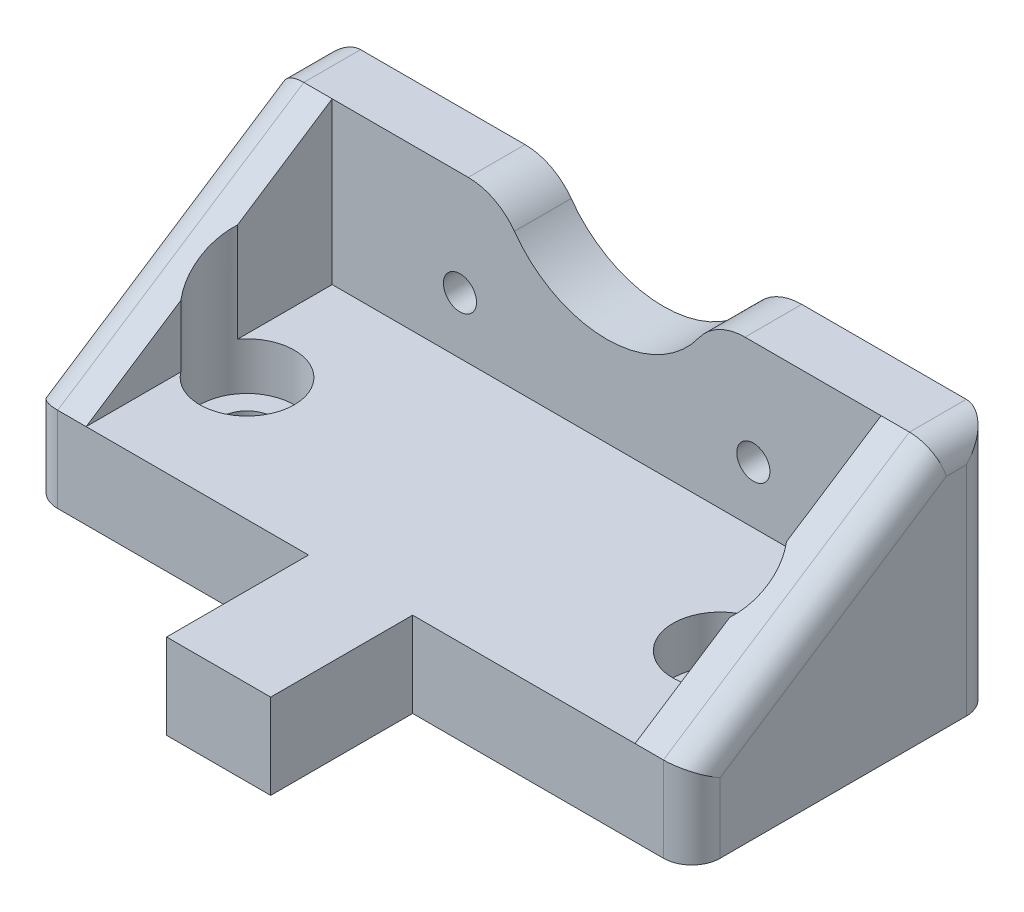
ISO-10303-21;
HEADER;
FILE_DESCRIPTION(('STEP AP214'),'2;1');
FILE_NAME('part.step','',(''),(''),'','','');
FILE_SCHEMA(('AUTOMOTIVE_DESIGN { 1 0 10303 214 1 1 1 1 }'));
ENDSEC;
DATA;
#1=APPLICATION_CONTEXT('core data for automotive mechanical design processes');
#2=APPLICATION_PROTOCOL_DEFINITION('international standard','automotive_design',2000,#1);
#3=PRODUCT_CONTEXT('',#1,'mechanical');
#4=PRODUCT('Part','Part','',(#3));
#5=PRODUCT_RELATED_PRODUCT_CATEGORY('part','',(#4));
#6=PRODUCT_DEFINITION_FORMATION('','',#4);
#7=PRODUCT_DEFINITION_CONTEXT('part definition',#1,'design');
#8=PRODUCT_DEFINITION('design','',#6,#7);
#9=PRODUCT_DEFINITION_SHAPE('','',#8);
#10=(LENGTH_UNIT() NAMED_UNIT(*) SI_UNIT(.MILLI.,.METRE.));
#11=(NAMED_UNIT(*) PLANE_ANGLE_UNIT() SI_UNIT($,.RADIAN.));
#12=(NAMED_UNIT(*) SI_UNIT($,.STERADIAN.) SOLID_ANGLE_UNIT());
#13=UNCERTAINTY_MEASURE_WITH_UNIT(LENGTH_MEASURE(1.E-05),#10,'distance_accuracy_value','');
#14=(GEOMETRIC_REPRESENTATION_CONTEXT(3) GLOBAL_UNCERTAINTY_ASSIGNED_CONTEXT((#13)) GLOBAL_UNIT_ASSIGNED_CONTEXT((#10,
#11,#12)) REPRESENTATION_CONTEXT('',''));
#15=CARTESIAN_POINT('',(0.,0.,0.));
#16=DIRECTION('',(0.,0.,1.));
#17=DIRECTION('',(1.,0.,0.));
#18=AXIS2_PLACEMENT_3D('',#15,#16,#17);
#19=CARTESIAN_POINT('',(14.6201915172135,20.,-10.));
#20=DIRECTION('',(0.,0.,1.));
#21=DIRECTION('',(1.,0.,0.));
#22=AXIS2_PLACEMENT_3D('',#19,#20,#21);
#23=PLANE('',#22);
#24=DIRECTION('',(1.,0.,0.));
#25=VECTOR('',#24,1.);
#26=CARTESIAN_POINT('',(-14.6201915172135,26.,-10.));
#27=LINE('',#26,#25);
#28=CARTESIAN_POINT('',(-29.,26.,-10.));
#29=VERTEX_POINT('',#28);
#30=CARTESIAN_POINT('',(-14.6201915172135,26.,-10.));
#31=VERTEX_POINT('',#30);
#32=EDGE_CURVE('E281',#29,#31,#27,.T.);
#33=ORIENTED_EDGE('',*,*,#32,.F.);
#34=DIRECTION('',(0.,1.,0.));
#35=VECTOR('',#34,1.);
#36=CARTESIAN_POINT('',(-29.,26.,-10.));
#37=LINE('',#36,#35);
#38=CARTESIAN_POINT('',(-29.,9.,-10.));
#39=VERTEX_POINT('',#38);
#40=EDGE_CURVE('E233',#39,#29,#37,.T.);
#41=ORIENTED_EDGE('',*,*,#40,.F.);
#42=DIRECTION('',(-1.,0.,0.));
#43=VECTOR('',#42,1.);
#44=CARTESIAN_POINT('',(35.,9.,-10.));
#45=LINE('',#44,#43);
#46=CARTESIAN_POINT('',(29.,9.,-10.));
#47=VERTEX_POINT('',#46);
#48=EDGE_CURVE('E278',#47,#39,#45,.T.);
#49=ORIENTED_EDGE('',*,*,#48,.F.);
#50=DIRECTION('',(0.,1.,0.));
#51=VECTOR('',#50,1.);
#52=CARTESIAN_POINT('',(29.,26.,-10.));
#53=LINE('',#52,#51);
#54=CARTESIAN_POINT('',(29.,26.,-10.));
#55=VERTEX_POINT('',#54);
#56=EDGE_CURVE('E259',#47,#55,#53,.T.);
#57=ORIENTED_EDGE('',*,*,#56,.T.);
#58=DIRECTION('',(1.,0.,0.));
#59=VECTOR('',#58,1.);
#60=CARTESIAN_POINT('',(35.,26.,-10.));
#61=LINE('',#60,#59);
#62=CARTESIAN_POINT('',(14.6201915172135,26.,-10.));
#63=VERTEX_POINT('',#62);
#64=EDGE_CURVE('E442',#63,#55,#61,.T.);
#65=ORIENTED_EDGE('',*,*,#64,.F.);
#66=CARTESIAN_POINT('',(14.6201915172135,20.,-10.));
#67=DIRECTION('',(0.,0.,-1.));
#68=DIRECTION('',(1.,0.,0.));
#69=AXIS2_PLACEMENT_3D('',#66,#67,#68);
#70=CIRCLE('',#69,6.);
#71=CARTESIAN_POINT('',(9.74679434480897,23.5,-10.));
#72=VERTEX_POINT('',#71);
#73=EDGE_CURVE('E555',#72,#63,#70,.T.);
#74=ORIENTED_EDGE('',*,*,#73,.F.);
#75=CARTESIAN_POINT('',(0.,30.5,-10.));
#76=DIRECTION('',(0.,0.,1.));
#77=DIRECTION('',(-1.,0.,0.));
#78=AXIS2_PLACEMENT_3D('',#75,#76,#77);
#79=CIRCLE('',#78,12.);
#80=CARTESIAN_POINT('',(-9.74679434480895,23.5,-10.));
#81=VERTEX_POINT('',#80);
#82=EDGE_CURVE('E557',#81,#72,#79,.T.);
#83=ORIENTED_EDGE('',*,*,#82,.F.);
#84=CARTESIAN_POINT('',(-14.6201915172135,19.9999999999999,-10.));
#85=DIRECTION('',(0.,0.,-1.));
#86=DIRECTION('',(-1.,0.,0.));
#87=AXIS2_PLACEMENT_3D('',#84,#85,#86);
#88=CIRCLE('',#87,6.00000000000011);
#89=EDGE_CURVE('E559',#31,#81,#88,.T.);
#90=ORIENTED_EDGE('',*,*,#89,.F.);
#91=EDGE_LOOP('',(#33,#41,#49,#57,#65,#74,#83,#90));
#92=FACE_BOUND('',#91,.T.);
#93=CARTESIAN_POINT('',(15.5,15.,-10.));
#94=DIRECTION('',(0.,0.,1.));
#95=DIRECTION('',(1.,0.,0.));
#96=AXIS2_PLACEMENT_3D('',#93,#94,#95);
#97=CIRCLE('',#96,1.75);
#98=CARTESIAN_POINT('',(17.25,15.,-10.));
#99=VERTEX_POINT('',#98);
#100=EDGE_CURVE('E236',#99,#99,#97,.T.);
#101=ORIENTED_EDGE('',*,*,#100,.F.);
#102=EDGE_LOOP('',(#101));
#103=FACE_BOUND('',#102,.T.);
#104=CARTESIAN_POINT('',(-15.5,15.,-10.));
#105=DIRECTION('',(0.,0.,-1.));
#106=DIRECTION('',(-1.,0.,0.));
#107=AXIS2_PLACEMENT_3D('',#104,#105,#106);
#108=CIRCLE('',#107,1.75);
#109=CARTESIAN_POINT('',(-17.25,15.,-10.));
#110=VERTEX_POINT('',#109);
#111=EDGE_CURVE('E342',#110,#110,#108,.T.);
#112=ORIENTED_EDGE('',*,*,#111,.T.);
#113=EDGE_LOOP('',(#112));
#114=FACE_BOUND('',#113,.T.);
#115=ADVANCED_FACE('F33',(#92,#103,#114),#23,.T.);
#116=CARTESIAN_POINT('',(-35.,9.,-16.));
#117=DIRECTION('',(0.,0.,1.));
#118=DIRECTION('',(1.,0.,0.));
#119=AXIS2_PLACEMENT_3D('',#116,#117,#118);
#120=PLANE('',#119);
#121=DIRECTION('',(1.,0.,0.));
#122=VECTOR('',#121,1.);
#123=CARTESIAN_POINT('',(35.,26.,-16.));
#124=LINE('',#123,#122);
#125=CARTESIAN_POINT('',(14.6201915172135,26.,-16.));
#126=VERTEX_POINT('',#125);
#127=CARTESIAN_POINT('',(32.,26.,-16.));
#128=VERTEX_POINT('',#127);
#129=EDGE_CURVE('E282',#126,#128,#124,.T.);
#130=ORIENTED_EDGE('',*,*,#129,.T.);
#131=DIRECTION('',(0.,-1.,0.));
#132=VECTOR('',#131,1.);
#133=CARTESIAN_POINT('',(32.,9.,-16.));
#134=LINE('',#133,#132);
#135=CARTESIAN_POINT('',(32.,0.,-16.));
#136=VERTEX_POINT('',#135);
#137=EDGE_CURVE('E320',#128,#136,#134,.T.);
#138=ORIENTED_EDGE('',*,*,#137,.T.);
#139=DIRECTION('',(-1.,0.,0.));
#140=VECTOR('',#139,1.);
#141=CARTESIAN_POINT('',(-35.,0.,-16.));
#142=LINE('',#141,#140);
#143=CARTESIAN_POINT('',(-32.,0.,-16.));
#144=VERTEX_POINT('',#143);
#145=EDGE_CURVE('E370',#136,#144,#142,.T.);
#146=ORIENTED_EDGE('',*,*,#145,.T.);
#147=DIRECTION('',(0.,-1.,0.));
#148=VECTOR('',#147,1.);
#149=CARTESIAN_POINT('',(-32.,9.,-16.));
#150=LINE('',#149,#148);
#151=CARTESIAN_POINT('',(-32.,26.,-16.));
#152=VERTEX_POINT('',#151);
#153=EDGE_CURVE('E318',#144,#152,#150,.F.);
#154=ORIENTED_EDGE('',*,*,#153,.T.);
#155=DIRECTION('',(1.,0.,0.));
#156=VECTOR('',#155,1.);
#157=CARTESIAN_POINT('',(-14.6201915172135,26.,-16.));
#158=LINE('',#157,#156);
#159=CARTESIAN_POINT('',(-14.6201915172135,26.,-16.));
#160=VERTEX_POINT('',#159);
#161=EDGE_CURVE('E270',#152,#160,#158,.T.);
#162=ORIENTED_EDGE('',*,*,#161,.T.);
#163=CARTESIAN_POINT('',(-14.6201915172135,19.9999999999999,-16.));
#164=DIRECTION('',(0.,0.,-1.));
#165=DIRECTION('',(-1.,0.,0.));
#166=AXIS2_PLACEMENT_3D('',#163,#164,#165);
#167=CIRCLE('',#166,6.00000000000011);
#168=CARTESIAN_POINT('',(-9.74679434480895,23.5,-16.));
#169=VERTEX_POINT('',#168);
#170=EDGE_CURVE('E547',#160,#169,#167,.T.);
#171=ORIENTED_EDGE('',*,*,#170,.T.);
#172=CARTESIAN_POINT('',(0.,30.5,-16.));
#173=DIRECTION('',(0.,0.,1.));
#174=DIRECTION('',(-1.,0.,0.));
#175=AXIS2_PLACEMENT_3D('',#172,#173,#174);
#176=CIRCLE('',#175,12.);
#177=CARTESIAN_POINT('',(9.74679434480897,23.5,-16.));
#178=VERTEX_POINT('',#177);
#179=EDGE_CURVE('E546',#169,#178,#176,.T.);
#180=ORIENTED_EDGE('',*,*,#179,.T.);
#181=CARTESIAN_POINT('',(14.6201915172135,20.,-16.));
#182=DIRECTION('',(0.,0.,-1.));
#183=DIRECTION('',(1.,0.,0.));
#184=AXIS2_PLACEMENT_3D('',#181,#182,#183);
#185=CIRCLE('',#184,6.);
#186=EDGE_CURVE('E545',#178,#126,#185,.T.);
#187=ORIENTED_EDGE('',*,*,#186,.T.);
#188=EDGE_LOOP('',(#130,#138,#146,#154,#162,#171,#180,#187));
#189=FACE_BOUND('',#188,.T.);
#190=CARTESIAN_POINT('',(15.5,15.,-16.));
#191=DIRECTION('',(0.,0.,1.));
#192=DIRECTION('',(1.,0.,0.));
#193=AXIS2_PLACEMENT_3D('',#190,#191,#192);
#194=CIRCLE('',#193,1.75);
#195=CARTESIAN_POINT('',(17.25,15.,-16.));
#196=VERTEX_POINT('',#195);
#197=EDGE_CURVE('E237',#196,#196,#194,.T.);
#198=ORIENTED_EDGE('',*,*,#197,.T.);
#199=EDGE_LOOP('',(#198));
#200=FACE_BOUND('',#199,.T.);
#201=CARTESIAN_POINT('',(-15.5,15.,-16.));
#202=DIRECTION('',(0.,0.,-1.));
#203=DIRECTION('',(-1.,0.,0.));
#204=AXIS2_PLACEMENT_3D('',#201,#202,#203);
#205=CIRCLE('',#204,1.75);
#206=CARTESIAN_POINT('',(-17.25,15.,-16.));
#207=VERTEX_POINT('',#206);
#208=EDGE_CURVE('E599',#207,#207,#205,.T.);
#209=ORIENTED_EDGE('',*,*,#208,.F.);
#210=EDGE_LOOP('',(#209));
#211=FACE_BOUND('',#210,.T.);
#212=ADVANCED_FACE('F460',(#189,#200,#211),#120,.F.);
#213=CARTESIAN_POINT('',(-29.,9.,-10.));
#214=DIRECTION('',(-1.,0.,0.));
#215=DIRECTION('',(0.,0.,-1.));
#216=AXIS2_PLACEMENT_3D('',#213,#214,#215);
#217=PLANE('',#216);
#218=DIRECTION('',(0.,-0.547249362982703,0.836969613973546));
#219=VECTOR('',#218,1.);
#220=CARTESIAN_POINT('',(-29.,9.,16.));
#221=LINE('',#220,#219);
#222=CARTESIAN_POINT('',(-29.,19.4615384615385,0.));
#223=VERTEX_POINT('',#222);
#224=EDGE_CURVE('E228',#29,#223,#221,.T.);
#225=ORIENTED_EDGE('',*,*,#224,.T.);
#226=DIRECTION('',(0.,-1.,0.));
#227=VECTOR('',#226,1.);
#228=CARTESIAN_POINT('',(-29.,26.,0.));
#229=LINE('',#228,#227);
#230=CARTESIAN_POINT('',(-29.,9.,0.));
#231=VERTEX_POINT('',#230);
#232=EDGE_CURVE('E212',#223,#231,#229,.T.);
#233=ORIENTED_EDGE('',*,*,#232,.T.);
#234=DIRECTION('',(0.,0.,-1.));
#235=VECTOR('',#234,1.);
#236=CARTESIAN_POINT('',(-29.,9.,-10.));
#237=LINE('',#236,#235);
#238=EDGE_CURVE('E222',#231,#39,#237,.T.);
#239=ORIENTED_EDGE('',*,*,#238,.T.);
#240=ORIENTED_EDGE('',*,*,#40,.T.);
#241=EDGE_LOOP('',(#225,#233,#239,#240));
#242=FACE_BOUND('',#241,.T.);
#243=ADVANCED_FACE('F466',(#242),#217,.F.);
#244=CARTESIAN_POINT('',(-25.,0.,3.));
#245=DIRECTION('',(0.,1.,0.));
#246=DIRECTION('',(0.,0.,1.));
#247=AXIS2_PLACEMENT_3D('',#244,#245,#246);
#248=CYLINDRICAL_SURFACE('',#247,2.75);
#249=CARTESIAN_POINT('',(-25.,0.,3.));
#250=DIRECTION('',(0.,-1.,0.));
#251=DIRECTION('',(0.,0.,1.));
#252=AXIS2_PLACEMENT_3D('',#249,#250,#251);
#253=CIRCLE('',#252,2.75);
#254=CARTESIAN_POINT('',(-25.,0.,5.75));
#255=VERTEX_POINT('',#254);
#256=EDGE_CURVE('E223',#255,#255,#253,.T.);
#257=ORIENTED_EDGE('',*,*,#256,.T.);
#258=EDGE_LOOP('',(#257));
#259=FACE_BOUND('',#258,.T.);
#260=CARTESIAN_POINT('',(-25.,4.,3.));
#261=DIRECTION('',(0.,1.,0.));
#262=DIRECTION('',(0.,0.,1.));
#263=AXIS2_PLACEMENT_3D('',#260,#261,#262);
#264=CIRCLE('',#263,2.75);
#265=CARTESIAN_POINT('',(-25.,4.,5.75));
#266=VERTEX_POINT('',#265);
#267=EDGE_CURVE('E290',#266,#266,#264,.T.);
#268=ORIENTED_EDGE('',*,*,#267,.T.);
#269=EDGE_LOOP('',(#268));
#270=FACE_BOUND('',#269,.T.);
#271=ADVANCED_FACE('F497',(#259,#270),#248,.F.);
#272=CARTESIAN_POINT('',(35.,9.,16.));
#273=DIRECTION('',(0.,1.,0.));
#274=DIRECTION('',(0.,0.,1.));
#275=AXIS2_PLACEMENT_3D('',#272,#273,#274);
#276=PLANE('',#275);
#277=CARTESIAN_POINT('',(-25.,9.,3.));
#278=DIRECTION('',(0.,1.,0.));
#279=DIRECTION('',(0.,0.,1.));
#280=AXIS2_PLACEMENT_3D('',#277,#278,#279);
#281=CIRCLE('',#280,5.);
#282=CARTESIAN_POINT('',(-29.,9.,5.99999999999999));
#283=VERTEX_POINT('',#282);
#284=EDGE_CURVE('E204',#283,#231,#281,.T.);
#285=ORIENTED_EDGE('',*,*,#284,.F.);
#286=CARTESIAN_POINT('',(-29.,9.,16.));
#287=VERTEX_POINT('',#286);
#288=EDGE_CURVE('E219',#287,#283,#237,.T.);
#289=ORIENTED_EDGE('',*,*,#288,.F.);
#290=DIRECTION('',(1.,0.,0.));
#291=VECTOR('',#290,1.);
#292=CARTESIAN_POINT('',(-35.,9.,16.));
#293=LINE('',#292,#291);
#294=CARTESIAN_POINT('',(-5.5,9.,16.));
#295=VERTEX_POINT('',#294);
#296=EDGE_CURVE('E386',#287,#295,#293,.T.);
#297=ORIENTED_EDGE('',*,*,#296,.T.);
#298=DIRECTION('',(0.,0.,1.));
#299=VECTOR('',#298,1.);
#300=CARTESIAN_POINT('',(-5.5,9.,31.));
#301=LINE('',#300,#299);
#302=CARTESIAN_POINT('',(-5.5,9.,31.));
#303=VERTEX_POINT('',#302);
#304=EDGE_CURVE('E405',#295,#303,#301,.T.);
#305=ORIENTED_EDGE('',*,*,#304,.T.);
#306=DIRECTION('',(1.,0.,0.));
#307=VECTOR('',#306,1.);
#308=CARTESIAN_POINT('',(-5.5,9.,31.));
#309=LINE('',#308,#307);
#310=CARTESIAN_POINT('',(5.5,9.,31.));
#311=VERTEX_POINT('',#310);
#312=EDGE_CURVE('E418',#303,#311,#309,.T.);
#313=ORIENTED_EDGE('',*,*,#312,.T.);
#314=DIRECTION('',(0.,0.,-1.));
#315=VECTOR('',#314,1.);
#316=CARTESIAN_POINT('',(5.5,9.,31.));
#317=LINE('',#316,#315);
#318=CARTESIAN_POINT('',(5.5,9.,16.));
#319=VERTEX_POINT('',#318);
#320=EDGE_CURVE('E415',#311,#319,#317,.T.);
#321=ORIENTED_EDGE('',*,*,#320,.T.);
#322=DIRECTION('',(1.,0.,0.));
#323=VECTOR('',#322,1.);
#324=CARTESIAN_POINT('',(5.5,9.,16.));
#325=LINE('',#324,#323);
#326=CARTESIAN_POINT('',(29.,9.,16.));
#327=VERTEX_POINT('',#326);
#328=EDGE_CURVE('E391',#319,#327,#325,.T.);
#329=ORIENTED_EDGE('',*,*,#328,.T.);
#330=DIRECTION('',(0.,0.,-1.));
#331=VECTOR('',#330,1.);
#332=CARTESIAN_POINT('',(29.,9.,-10.));
#333=LINE('',#332,#331);
#334=CARTESIAN_POINT('',(29.,9.,5.99999999999999));
#335=VERTEX_POINT('',#334);
#336=EDGE_CURVE('E256',#327,#335,#333,.T.);
#337=ORIENTED_EDGE('',*,*,#336,.T.);
#338=CARTESIAN_POINT('',(25.,9.,3.));
#339=DIRECTION('',(0.,1.,0.));
#340=DIRECTION('',(0.,0.,1.));
#341=AXIS2_PLACEMENT_3D('',#338,#339,#340);
#342=CIRCLE('',#341,5.);
#343=CARTESIAN_POINT('',(29.,9.,0.));
#344=VERTEX_POINT('',#343);
#345=EDGE_CURVE('E249',#335,#344,#342,.F.);
#346=ORIENTED_EDGE('',*,*,#345,.T.);
#347=EDGE_CURVE('E255',#344,#47,#333,.T.);
#348=ORIENTED_EDGE('',*,*,#347,.T.);
#349=ORIENTED_EDGE('',*,*,#48,.T.);
#350=ORIENTED_EDGE('',*,*,#238,.F.);
#351=EDGE_LOOP('',(#285,#289,#297,#305,#313,#321,#329,#337,#346,#348,#349,#350));
#352=FACE_BOUND('',#351,.T.);
#353=ADVANCED_FACE('F218',(#352),#276,.T.);
#354=CARTESIAN_POINT('',(35.,0.,16.));
#355=DIRECTION('',(0.,1.,0.));
#356=DIRECTION('',(0.,0.,1.));
#357=AXIS2_PLACEMENT_3D('',#354,#355,#356);
#358=PLANE('',#357);
#359=DIRECTION('',(0.,0.,-1.));
#360=VECTOR('',#359,1.);
#361=CARTESIAN_POINT('',(35.,0.,-16.));
#362=LINE('',#361,#360);
#363=CARTESIAN_POINT('',(35.,0.,13.));
#364=VERTEX_POINT('',#363);
#365=CARTESIAN_POINT('',(35.,0.,-13.));
#366=VERTEX_POINT('',#365);
#367=EDGE_CURVE('E374',#364,#366,#362,.T.);
#368=ORIENTED_EDGE('',*,*,#367,.F.);
#369=CARTESIAN_POINT('',(32.,0.,13.));
#370=DIRECTION('',(0.,1.,0.));
#371=DIRECTION('',(0.,0.,1.));
#372=AXIS2_PLACEMENT_3D('',#369,#370,#371);
#373=CIRCLE('',#372,3.);
#374=CARTESIAN_POINT('',(32.,0.,16.));
#375=VERTEX_POINT('',#374);
#376=EDGE_CURVE('E310',#364,#375,#373,.F.);
#377=ORIENTED_EDGE('',*,*,#376,.T.);
#378=DIRECTION('',(1.,0.,0.));
#379=VECTOR('',#378,1.);
#380=CARTESIAN_POINT('',(5.5,0.,16.));
#381=LINE('',#380,#379);
#382=CARTESIAN_POINT('',(5.5,0.,16.));
#383=VERTEX_POINT('',#382);
#384=EDGE_CURVE('E383',#383,#375,#381,.T.);
#385=ORIENTED_EDGE('',*,*,#384,.F.);
#386=DIRECTION('',(0.,0.,-1.));
#387=VECTOR('',#386,1.);
#388=CARTESIAN_POINT('',(5.5,0.,31.));
#389=LINE('',#388,#387);
#390=CARTESIAN_POINT('',(5.5,0.,31.));
#391=VERTEX_POINT('',#390);
#392=EDGE_CURVE('E381',#391,#383,#389,.T.);
#393=ORIENTED_EDGE('',*,*,#392,.F.);
#394=DIRECTION('',(1.,0.,0.));
#395=VECTOR('',#394,1.);
#396=CARTESIAN_POINT('',(-5.5,0.,31.));
#397=LINE('',#396,#395);
#398=CARTESIAN_POINT('',(-5.5,0.,31.));
#399=VERTEX_POINT('',#398);
#400=EDGE_CURVE('E379',#399,#391,#397,.T.);
#401=ORIENTED_EDGE('',*,*,#400,.F.);
#402=DIRECTION('',(0.,0.,1.));
#403=VECTOR('',#402,1.);
#404=CARTESIAN_POINT('',(-5.5,0.,31.));
#405=LINE('',#404,#403);
#406=CARTESIAN_POINT('',(-5.5,0.,16.));
#407=VERTEX_POINT('',#406);
#408=EDGE_CURVE('E372',#407,#399,#405,.T.);
#409=ORIENTED_EDGE('',*,*,#408,.F.);
#410=DIRECTION('',(1.,0.,0.));
#411=VECTOR('',#410,1.);
#412=CARTESIAN_POINT('',(-35.,0.,16.));
#413=LINE('',#412,#411);
#414=CARTESIAN_POINT('',(-32.,0.,16.));
#415=VERTEX_POINT('',#414);
#416=EDGE_CURVE('E369',#415,#407,#413,.T.);
#417=ORIENTED_EDGE('',*,*,#416,.F.);
#418=CARTESIAN_POINT('',(-32.,0.,13.));
#419=DIRECTION('',(0.,1.,0.));
#420=DIRECTION('',(0.,0.,1.));
#421=AXIS2_PLACEMENT_3D('',#418,#419,#420);
#422=CIRCLE('',#421,3.);
#423=CARTESIAN_POINT('',(-35.,0.,13.));
#424=VERTEX_POINT('',#423);
#425=EDGE_CURVE('E306',#415,#424,#422,.F.);
#426=ORIENTED_EDGE('',*,*,#425,.T.);
#427=DIRECTION('',(0.,0.,1.));
#428=VECTOR('',#427,1.);
#429=CARTESIAN_POINT('',(-35.,0.,-16.));
#430=LINE('',#429,#428);
#431=CARTESIAN_POINT('',(-35.,0.,-13.));
#432=VERTEX_POINT('',#431);
#433=EDGE_CURVE('E361',#432,#424,#430,.T.);
#434=ORIENTED_EDGE('',*,*,#433,.F.);
#435=CARTESIAN_POINT('',(-32.,0.,-13.));
#436=DIRECTION('',(0.,1.,0.));
#437=DIRECTION('',(0.,0.,1.));
#438=AXIS2_PLACEMENT_3D('',#435,#436,#437);
#439=CIRCLE('',#438,3.);
#440=EDGE_CURVE('E304',#432,#144,#439,.F.);
#441=ORIENTED_EDGE('',*,*,#440,.T.);
#442=ORIENTED_EDGE('',*,*,#145,.F.);
#443=CARTESIAN_POINT('',(32.,0.,-13.));
#444=DIRECTION('',(0.,1.,0.));
#445=DIRECTION('',(0.,0.,1.));
#446=AXIS2_PLACEMENT_3D('',#443,#444,#445);
#447=CIRCLE('',#446,3.);
#448=EDGE_CURVE('E308',#136,#366,#447,.F.);
#449=ORIENTED_EDGE('',*,*,#448,.T.);
#450=EDGE_LOOP('',(#368,#377,#385,#393,#401,#409,#417,#426,#434,#441,#442,#449));
#451=FACE_BOUND('',#450,.T.);
#452=CARTESIAN_POINT('',(25.,0.,3.));
#453=DIRECTION('',(0.,1.,0.));
#454=DIRECTION('',(0.,0.,1.));
#455=AXIS2_PLACEMENT_3D('',#452,#453,#454);
#456=CIRCLE('',#455,2.75);
#457=CARTESIAN_POINT('',(25.,0.,5.75));
#458=VERTEX_POINT('',#457);
#459=EDGE_CURVE('E252',#458,#458,#456,.T.);
#460=ORIENTED_EDGE('',*,*,#459,.T.);
#461=EDGE_LOOP('',(#460));
#462=FACE_BOUND('',#461,.T.);
#463=ORIENTED_EDGE('',*,*,#256,.F.);
#464=EDGE_LOOP('',(#463));
#465=FACE_BOUND('',#464,.T.);
#466=ADVANCED_FACE('F364',(#451,#462,#465),#358,.F.);
#467=CARTESIAN_POINT('',(29.,9.,16.));
#468=DIRECTION('',(0.,0.836969613973546,0.547249362982703));
#469=DIRECTION('',(0.,-0.547249362982703,0.836969613973546));
#470=AXIS2_PLACEMENT_3D('',#467,#468,#469);
#471=PLANE('',#470);
#472=DIRECTION('',(1.,0.,0.));
#473=VECTOR('',#472,1.);
#474=CARTESIAN_POINT('',(29.,9.,16.));
#475=LINE('',#474,#473);
#476=CARTESIAN_POINT('',(32.,9.,16.));
#477=VERTEX_POINT('',#476);
#478=EDGE_CURVE('E267',#327,#477,#475,.T.);
#479=ORIENTED_EDGE('',*,*,#478,.T.);
#480=DIRECTION('',(0.,-0.547249362982703,0.836969613973546));
#481=VECTOR('',#480,1.);
#482=CARTESIAN_POINT('',(32.,26.,-10.));
#483=LINE('',#482,#481);
#484=CARTESIAN_POINT('',(32.,26.,-10.));
#485=VERTEX_POINT('',#484);
#486=EDGE_CURVE('E314',#477,#485,#483,.F.);
#487=ORIENTED_EDGE('',*,*,#486,.T.);
#488=DIRECTION('',(1.,0.,0.));
#489=VECTOR('',#488,1.);
#490=CARTESIAN_POINT('',(29.,26.,-10.));
#491=LINE('',#490,#489);
#492=EDGE_CURVE('E266',#55,#485,#491,.T.);
#493=ORIENTED_EDGE('',*,*,#492,.F.);
#494=DIRECTION('',(0.,-0.547249362982703,0.836969613973546));
#495=VECTOR('',#494,1.);
#496=CARTESIAN_POINT('',(29.,9.,16.));
#497=LINE('',#496,#495);
#498=CARTESIAN_POINT('',(29.,19.4615384615385,0.));
#499=VERTEX_POINT('',#498);
#500=EDGE_CURVE('E263',#55,#499,#497,.T.);
#501=ORIENTED_EDGE('',*,*,#500,.T.);
#502=CARTESIAN_POINT('',(25.,17.5,3.));
#503=DIRECTION('',(0.,0.836969613973546,0.547249362982703));
#504=DIRECTION('',(0.,-0.547249362982703,0.836969613973546));
#505=AXIS2_PLACEMENT_3D('',#502,#503,#504);
#506=ELLIPSE('',#505,5.97393252577272,5.);
#507=CARTESIAN_POINT('',(29.,15.5384615384615,5.99999999999999));
#508=VERTEX_POINT('',#507);
#509=EDGE_CURVE('E246',#499,#508,#506,.F.);
#510=ORIENTED_EDGE('',*,*,#509,.T.);
#511=EDGE_CURVE('E262',#508,#327,#497,.T.);
#512=ORIENTED_EDGE('',*,*,#511,.T.);
#513=EDGE_LOOP('',(#479,#487,#493,#501,#510,#512));
#514=FACE_BOUND('',#513,.T.);
#515=ADVANCED_FACE('F473',(#514),#471,.T.);
#516=CARTESIAN_POINT('',(29.,9.,-10.));
#517=DIRECTION('',(1.,0.,0.));
#518=DIRECTION('',(0.,0.,-1.));
#519=AXIS2_PLACEMENT_3D('',#516,#517,#518);
#520=PLANE('',#519);
#521=DIRECTION('',(0.,-1.,0.));
#522=VECTOR('',#521,1.);
#523=CARTESIAN_POINT('',(29.,26.000025,5.99999999999999));
#524=LINE('',#523,#522);
#525=EDGE_CURVE('E213',#335,#508,#524,.F.);
#526=ORIENTED_EDGE('',*,*,#525,.F.);
#527=ORIENTED_EDGE('',*,*,#336,.F.);
#528=ORIENTED_EDGE('',*,*,#511,.F.);
#529=EDGE_LOOP('',(#526,#527,#528));
#530=FACE_BOUND('',#529,.T.);
#531=ADVANCED_FACE('F588',(#530),#520,.F.);
#532=DIRECTION('',(0.,-1.,0.));
#533=VECTOR('',#532,1.);
#534=CARTESIAN_POINT('',(29.,26.000025,0.));
#535=LINE('',#534,#533);
#536=EDGE_CURVE('E287',#499,#344,#535,.T.);
#537=ORIENTED_EDGE('',*,*,#536,.F.);
#538=ORIENTED_EDGE('',*,*,#500,.F.);
#539=ORIENTED_EDGE('',*,*,#56,.F.);
#540=ORIENTED_EDGE('',*,*,#347,.F.);
#541=EDGE_LOOP('',(#537,#538,#539,#540));
#542=FACE_BOUND('',#541,.T.);
#543=ADVANCED_FACE('F592',(#542),#520,.F.);
#544=CARTESIAN_POINT('',(25.,0.,3.));
#545=DIRECTION('',(0.,1.,0.));
#546=DIRECTION('',(0.,0.,1.));
#547=AXIS2_PLACEMENT_3D('',#544,#545,#546);
#548=CYLINDRICAL_SURFACE('',#547,2.75);
#549=ORIENTED_EDGE('',*,*,#459,.F.);
#550=EDGE_LOOP('',(#549));
#551=FACE_BOUND('',#550,.T.);
#552=CARTESIAN_POINT('',(25.,4.,3.));
#553=DIRECTION('',(0.,1.,0.));
#554=DIRECTION('',(0.,0.,1.));
#555=AXIS2_PLACEMENT_3D('',#552,#553,#554);
#556=CIRCLE('',#555,2.75);
#557=CARTESIAN_POINT('',(25.,4.,5.75));
#558=VERTEX_POINT('',#557);
#559=EDGE_CURVE('E245',#558,#558,#556,.F.);
#560=ORIENTED_EDGE('',*,*,#559,.F.);
#561=EDGE_LOOP('',(#560));
#562=FACE_BOUND('',#561,.T.);
#563=ADVANCED_FACE('F516',(#551,#562),#548,.F.);
#564=CARTESIAN_POINT('',(35.,9.,-16.));
#565=DIRECTION('',(-1.,0.,0.));
#566=DIRECTION('',(0.,0.,1.));
#567=AXIS2_PLACEMENT_3D('',#564,#565,#566);
#568=PLANE('',#567);
#569=DIRECTION('',(0.,-0.547249362982703,0.836969613973546));
#570=VECTOR('',#569,1.);
#571=CARTESIAN_POINT('',(35.,6.48909115807936,14.3582519110519));
#572=LINE('',#571,#570);
#573=CARTESIAN_POINT('',(35.,23.,-10.8937263177679));
#574=VERTEX_POINT('',#573);
#575=CARTESIAN_POINT('',(35.,7.37717894607483,13.));
#576=VERTEX_POINT('',#575);
#577=EDGE_CURVE('E299',#574,#576,#572,.T.);
#578=ORIENTED_EDGE('',*,*,#577,.T.);
#579=DIRECTION('',(0.,-1.,0.));
#580=VECTOR('',#579,1.);
#581=CARTESIAN_POINT('',(35.,9.,13.));
#582=LINE('',#581,#580);
#583=EDGE_CURVE('E301',#576,#364,#582,.T.);
#584=ORIENTED_EDGE('',*,*,#583,.T.);
#585=ORIENTED_EDGE('',*,*,#367,.T.);
#586=DIRECTION('',(0.,-1.,0.));
#587=VECTOR('',#586,1.);
#588=CARTESIAN_POINT('',(35.,9.,-13.));
#589=LINE('',#588,#587);
#590=CARTESIAN_POINT('',(35.,23.,-13.));
#591=VERTEX_POINT('',#590);
#592=EDGE_CURVE('E295',#366,#591,#589,.F.);
#593=ORIENTED_EDGE('',*,*,#592,.T.);
#594=DIRECTION('',(0.,0.,-1.));
#595=VECTOR('',#594,1.);
#596=CARTESIAN_POINT('',(35.,23.,-10.));
#597=LINE('',#596,#595);
#598=EDGE_CURVE('E297',#591,#574,#597,.F.);
#599=ORIENTED_EDGE('',*,*,#598,.T.);
#600=EDGE_LOOP('',(#578,#584,#585,#593,#599));
#601=FACE_BOUND('',#600,.T.);
#602=ADVANCED_FACE('F512',(#601),#568,.F.);
#603=CARTESIAN_POINT('',(-35.,9.,-16.));
#604=DIRECTION('',(1.,0.,0.));
#605=DIRECTION('',(0.,0.,-1.));
#606=AXIS2_PLACEMENT_3D('',#603,#604,#605);
#607=PLANE('',#606);
#608=ORIENTED_EDGE('',*,*,#433,.T.);
#609=DIRECTION('',(0.,-1.,0.));
#610=VECTOR('',#609,1.);
#611=CARTESIAN_POINT('',(-35.,9.,13.));
#612=LINE('',#611,#610);
#613=CARTESIAN_POINT('',(-35.,7.37717894607483,13.));
#614=VERTEX_POINT('',#613);
#615=EDGE_CURVE('E56',#424,#614,#612,.F.);
#616=ORIENTED_EDGE('',*,*,#615,.T.);
#617=DIRECTION('',(0.,-0.547249362982703,0.836969613973546));
#618=VECTOR('',#617,1.);
#619=CARTESIAN_POINT('',(-35.,21.1460859767322,-8.05832839982894));
#620=LINE('',#619,#618);
#621=CARTESIAN_POINT('',(-35.,23.,-10.8937263177679));
#622=VERTEX_POINT('',#621);
#623=EDGE_CURVE('E329',#614,#622,#620,.F.);
#624=ORIENTED_EDGE('',*,*,#623,.T.);
#625=DIRECTION('',(0.,0.,-1.));
#626=VECTOR('',#625,1.);
#627=CARTESIAN_POINT('',(-35.,23.,-16.));
#628=LINE('',#627,#626);
#629=CARTESIAN_POINT('',(-35.,23.,-13.));
#630=VERTEX_POINT('',#629);
#631=EDGE_CURVE('E327',#622,#630,#628,.T.);
#632=ORIENTED_EDGE('',*,*,#631,.T.);
#633=DIRECTION('',(0.,-1.,0.));
#634=VECTOR('',#633,1.);
#635=CARTESIAN_POINT('',(-35.,9.,-13.));
#636=LINE('',#635,#634);
#637=EDGE_CURVE('E325',#630,#432,#636,.T.);
#638=ORIENTED_EDGE('',*,*,#637,.T.);
#639=EDGE_LOOP('',(#608,#616,#624,#632,#638));
#640=FACE_BOUND('',#639,.T.);
#641=ADVANCED_FACE('F360',(#640),#607,.F.);
#642=CARTESIAN_POINT('',(-35.,9.,16.));
#643=DIRECTION('',(0.,0.,-1.));
#644=DIRECTION('',(-1.,0.,0.));
#645=AXIS2_PLACEMENT_3D('',#642,#643,#644);
#646=PLANE('',#645);
#647=CARTESIAN_POINT('',(-32.,9.,16.));
#648=VERTEX_POINT('',#647);
#649=EDGE_CURVE('E443',#648,#287,#293,.T.);
#650=ORIENTED_EDGE('',*,*,#649,.F.);
#651=DIRECTION('',(0.,-1.,0.));
#652=VECTOR('',#651,1.);
#653=CARTESIAN_POINT('',(-32.,9.,16.));
#654=LINE('',#653,#652);
#655=EDGE_CURVE('E322',#648,#415,#654,.T.);
#656=ORIENTED_EDGE('',*,*,#655,.T.);
#657=ORIENTED_EDGE('',*,*,#416,.T.);
#658=DIRECTION('',(0.,-1.,0.));
#659=VECTOR('',#658,1.);
#660=CARTESIAN_POINT('',(-5.5,9.,16.));
#661=LINE('',#660,#659);
#662=EDGE_CURVE('E283',#295,#407,#661,.T.);
#663=ORIENTED_EDGE('',*,*,#662,.F.);
#664=ORIENTED_EDGE('',*,*,#296,.F.);
#665=EDGE_LOOP('',(#650,#656,#657,#663,#664));
#666=FACE_BOUND('',#665,.T.);
#667=ADVANCED_FACE('F445',(#666),#646,.F.);
#668=CARTESIAN_POINT('',(-5.5,9.,31.));
#669=DIRECTION('',(1.,0.,0.));
#670=DIRECTION('',(0.,0.,-1.));
#671=AXIS2_PLACEMENT_3D('',#668,#669,#670);
#672=PLANE('',#671);
#673=ORIENTED_EDGE('',*,*,#408,.T.);
#674=DIRECTION('',(0.,-1.,0.));
#675=VECTOR('',#674,1.);
#676=CARTESIAN_POINT('',(-5.5,9.,31.));
#677=LINE('',#676,#675);
#678=EDGE_CURVE('E393',#303,#399,#677,.T.);
#679=ORIENTED_EDGE('',*,*,#678,.F.);
#680=ORIENTED_EDGE('',*,*,#304,.F.);
#681=ORIENTED_EDGE('',*,*,#662,.T.);
#682=EDGE_LOOP('',(#673,#679,#680,#681));
#683=FACE_BOUND('',#682,.T.);
#684=ADVANCED_FACE('F404',(#683),#672,.F.);
#685=CARTESIAN_POINT('',(-5.5,9.,31.));
#686=DIRECTION('',(0.,0.,-1.));
#687=DIRECTION('',(-1.,0.,0.));
#688=AXIS2_PLACEMENT_3D('',#685,#686,#687);
#689=PLANE('',#688);
#690=ORIENTED_EDGE('',*,*,#400,.T.);
#691=DIRECTION('',(0.,-1.,0.));
#692=VECTOR('',#691,1.);
#693=CARTESIAN_POINT('',(5.5,9.,31.));
#694=LINE('',#693,#692);
#695=EDGE_CURVE('E390',#311,#391,#694,.T.);
#696=ORIENTED_EDGE('',*,*,#695,.F.);
#697=ORIENTED_EDGE('',*,*,#312,.F.);
#698=ORIENTED_EDGE('',*,*,#678,.T.);
#699=EDGE_LOOP('',(#690,#696,#697,#698));
#700=FACE_BOUND('',#699,.T.);
#701=ADVANCED_FACE('F410',(#700),#689,.F.);
#702=CARTESIAN_POINT('',(5.5,9.,31.));
#703=DIRECTION('',(-1.,0.,0.));
#704=DIRECTION('',(0.,0.,1.));
#705=AXIS2_PLACEMENT_3D('',#702,#703,#704);
#706=PLANE('',#705);
#707=ORIENTED_EDGE('',*,*,#392,.T.);
#708=DIRECTION('',(0.,-1.,0.));
#709=VECTOR('',#708,1.);
#710=CARTESIAN_POINT('',(5.5,9.,16.));
#711=LINE('',#710,#709);
#712=EDGE_CURVE('E387',#319,#383,#711,.T.);
#713=ORIENTED_EDGE('',*,*,#712,.F.);
#714=ORIENTED_EDGE('',*,*,#320,.F.);
#715=ORIENTED_EDGE('',*,*,#695,.T.);
#716=EDGE_LOOP('',(#707,#713,#714,#715));
#717=FACE_BOUND('',#716,.T.);
#718=ADVANCED_FACE('F413',(#717),#706,.F.);
#719=CARTESIAN_POINT('',(5.5,9.,16.));
#720=DIRECTION('',(0.,0.,-1.));
#721=DIRECTION('',(-1.,0.,0.));
#722=AXIS2_PLACEMENT_3D('',#719,#720,#721);
#723=PLANE('',#722);
#724=ORIENTED_EDGE('',*,*,#384,.T.);
#725=DIRECTION('',(0.,-1.,0.));
#726=VECTOR('',#725,1.);
#727=CARTESIAN_POINT('',(32.,9.,16.));
#728=LINE('',#727,#726);
#729=EDGE_CURVE('E312',#375,#477,#728,.F.);
#730=ORIENTED_EDGE('',*,*,#729,.T.);
#731=ORIENTED_EDGE('',*,*,#478,.F.);
#732=ORIENTED_EDGE('',*,*,#328,.F.);
#733=ORIENTED_EDGE('',*,*,#712,.T.);
#734=EDGE_LOOP('',(#724,#730,#731,#732,#733));
#735=FACE_BOUND('',#734,.T.);
#736=ADVANCED_FACE('F479',(#735),#723,.F.);
#737=CARTESIAN_POINT('',(35.,26.,-10.));
#738=DIRECTION('',(0.,1.,0.));
#739=DIRECTION('',(0.,0.,1.));
#740=AXIS2_PLACEMENT_3D('',#737,#738,#739);
#741=PLANE('',#740);
#742=ORIENTED_EDGE('',*,*,#492,.T.);
#743=DIRECTION('',(0.,0.,-1.));
#744=VECTOR('',#743,1.);
#745=CARTESIAN_POINT('',(32.,26.,-16.));
#746=LINE('',#745,#744);
#747=EDGE_CURVE('E316',#485,#128,#746,.T.);
#748=ORIENTED_EDGE('',*,*,#747,.T.);
#749=ORIENTED_EDGE('',*,*,#129,.F.);
#750=DIRECTION('',(0.,0.,-1.));
#751=VECTOR('',#750,1.);
#752=CARTESIAN_POINT('',(14.6201915172135,26.,-10.));
#753=LINE('',#752,#751);
#754=EDGE_CURVE('E424',#63,#126,#753,.T.);
#755=ORIENTED_EDGE('',*,*,#754,.F.);
#756=ORIENTED_EDGE('',*,*,#64,.T.);
#757=EDGE_LOOP('',(#742,#748,#749,#755,#756));
#758=FACE_BOUND('',#757,.T.);
#759=ADVANCED_FACE('F475',(#758),#741,.T.);
#760=CARTESIAN_POINT('',(14.6201915172135,20.,-10.));
#761=DIRECTION('',(0.,0.,-1.));
#762=DIRECTION('',(-1.,0.,0.));
#763=AXIS2_PLACEMENT_3D('',#760,#761,#762);
#764=CYLINDRICAL_SURFACE('',#763,6.);
#765=ORIENTED_EDGE('',*,*,#186,.F.);
#766=DIRECTION('',(0.,0.,-1.));
#767=VECTOR('',#766,1.);
#768=CARTESIAN_POINT('',(9.74679434480897,23.5,-10.));
#769=LINE('',#768,#767);
#770=EDGE_CURVE('E427',#72,#178,#769,.T.);
#771=ORIENTED_EDGE('',*,*,#770,.F.);
#772=ORIENTED_EDGE('',*,*,#73,.T.);
#773=ORIENTED_EDGE('',*,*,#754,.T.);
#774=EDGE_LOOP('',(#765,#771,#772,#773));
#775=FACE_BOUND('',#774,.T.);
#776=ADVANCED_FACE('F478',(#775),#764,.T.);
#777=CARTESIAN_POINT('',(0.,30.5,-10.));
#778=DIRECTION('',(0.,0.,-1.));
#779=DIRECTION('',(-1.,0.,0.));
#780=AXIS2_PLACEMENT_3D('',#777,#778,#779);
#781=CYLINDRICAL_SURFACE('',#780,12.);
#782=ORIENTED_EDGE('',*,*,#179,.F.);
#783=DIRECTION('',(0.,0.,-1.));
#784=VECTOR('',#783,1.);
#785=CARTESIAN_POINT('',(-9.74679434480895,23.5,-10.));
#786=LINE('',#785,#784);
#787=EDGE_CURVE('E433',#81,#169,#786,.T.);
#788=ORIENTED_EDGE('',*,*,#787,.F.);
#789=ORIENTED_EDGE('',*,*,#82,.T.);
#790=ORIENTED_EDGE('',*,*,#770,.T.);
#791=EDGE_LOOP('',(#782,#788,#789,#790));
#792=FACE_BOUND('',#791,.T.);
#793=ADVANCED_FACE('F483',(#792),#781,.F.);
#794=CARTESIAN_POINT('',(-14.6201915172135,19.9999999999999,-10.));
#795=DIRECTION('',(0.,0.,-1.));
#796=DIRECTION('',(-1.,0.,0.));
#797=AXIS2_PLACEMENT_3D('',#794,#795,#796);
#798=CYLINDRICAL_SURFACE('',#797,6.00000000000011);
#799=ORIENTED_EDGE('',*,*,#170,.F.);
#800=DIRECTION('',(0.,0.,-1.));
#801=VECTOR('',#800,1.);
#802=CARTESIAN_POINT('',(-14.6201915172135,26.,-10.));
#803=LINE('',#802,#801);
#804=EDGE_CURVE('E439',#31,#160,#803,.T.);
#805=ORIENTED_EDGE('',*,*,#804,.F.);
#806=ORIENTED_EDGE('',*,*,#89,.T.);
#807=ORIENTED_EDGE('',*,*,#787,.T.);
#808=EDGE_LOOP('',(#799,#805,#806,#807));
#809=FACE_BOUND('',#808,.T.);
#810=ADVANCED_FACE('F486',(#809),#798,.T.);
#811=CARTESIAN_POINT('',(-14.6201915172135,26.,-10.));
#812=DIRECTION('',(0.,1.,0.));
#813=DIRECTION('',(0.,0.,1.));
#814=AXIS2_PLACEMENT_3D('',#811,#812,#813);
#815=PLANE('',#814);
#816=ORIENTED_EDGE('',*,*,#161,.F.);
#817=DIRECTION('',(0.,0.,-1.));
#818=VECTOR('',#817,1.);
#819=CARTESIAN_POINT('',(-32.,26.,-10.));
#820=LINE('',#819,#818);
#821=CARTESIAN_POINT('',(-32.,26.,-10.));
#822=VERTEX_POINT('',#821);
#823=EDGE_CURVE('E11',#152,#822,#820,.F.);
#824=ORIENTED_EDGE('',*,*,#823,.T.);
#825=EDGE_CURVE('E275',#822,#29,#27,.T.);
#826=ORIENTED_EDGE('',*,*,#825,.T.);
#827=ORIENTED_EDGE('',*,*,#32,.T.);
#828=ORIENTED_EDGE('',*,*,#804,.T.);
#829=EDGE_LOOP('',(#816,#824,#826,#827,#828));
#830=FACE_BOUND('',#829,.T.);
#831=ADVANCED_FACE('F490',(#830),#815,.T.);
#832=CARTESIAN_POINT('',(25.,26.000025,3.));
#833=DIRECTION('',(0.,-1.,0.));
#834=DIRECTION('',(0.,0.,-1.));
#835=AXIS2_PLACEMENT_3D('',#832,#833,#834);
#836=CYLINDRICAL_SURFACE('',#835,5.);
#837=CARTESIAN_POINT('',(25.,4.,3.));
#838=DIRECTION('',(0.,1.,0.));
#839=DIRECTION('',(0.,0.,1.));
#840=AXIS2_PLACEMENT_3D('',#837,#838,#839);
#841=CIRCLE('',#840,5.);
#842=CARTESIAN_POINT('',(25.,4.,8.));
#843=VERTEX_POINT('',#842);
#844=EDGE_CURVE('E240',#843,#843,#841,.T.);
#845=ORIENTED_EDGE('',*,*,#844,.F.);
#846=EDGE_LOOP('',(#845));
#847=FACE_BOUND('',#846,.T.);
#848=ORIENTED_EDGE('',*,*,#525,.T.);
#849=ORIENTED_EDGE('',*,*,#509,.F.);
#850=ORIENTED_EDGE('',*,*,#536,.T.);
#851=ORIENTED_EDGE('',*,*,#345,.F.);
#852=EDGE_LOOP('',(#848,#849,#850,#851));
#853=FACE_BOUND('',#852,.T.);
#854=ADVANCED_FACE('F494',(#847,#853),#836,.F.);
#855=CARTESIAN_POINT('',(25.,4.,3.));
#856=DIRECTION('',(0.,1.,0.));
#857=DIRECTION('',(0.,0.,1.));
#858=AXIS2_PLACEMENT_3D('',#855,#856,#857);
#859=PLANE('',#858);
#860=ORIENTED_EDGE('',*,*,#844,.T.);
#861=EDGE_LOOP('',(#860));
#862=FACE_BOUND('',#861,.T.);
#863=ORIENTED_EDGE('',*,*,#559,.T.);
#864=EDGE_LOOP('',(#863));
#865=FACE_BOUND('',#864,.T.);
#866=ADVANCED_FACE('F630',(#862,#865),#859,.T.);
#867=CARTESIAN_POINT('',(15.5,15.,-16.));
#868=DIRECTION('',(0.,0.,1.));
#869=DIRECTION('',(1.,0.,0.));
#870=AXIS2_PLACEMENT_3D('',#867,#868,#869);
#871=CYLINDRICAL_SURFACE('',#870,1.75);
#872=ORIENTED_EDGE('',*,*,#197,.F.);
#873=EDGE_LOOP('',(#872));
#874=FACE_BOUND('',#873,.T.);
#875=ORIENTED_EDGE('',*,*,#100,.T.);
#876=EDGE_LOOP('',(#875));
#877=FACE_BOUND('',#876,.T.);
#878=ADVANCED_FACE('F627',(#874,#877),#871,.F.);
#879=CARTESIAN_POINT('',(-29.,9.,16.));
#880=DIRECTION('',(0.,-0.836969613973546,-0.547249362982703));
#881=DIRECTION('',(0.,0.547249362982703,-0.836969613973546));
#882=AXIS2_PLACEMENT_3D('',#879,#880,#881);
#883=PLANE('',#882);
#884=ORIENTED_EDGE('',*,*,#825,.F.);
#885=DIRECTION('',(0.,-0.547249362982703,0.836969613973546));
#886=VECTOR('',#885,1.);
#887=CARTESIAN_POINT('',(-32.,9.,16.));
#888=LINE('',#887,#886);
#889=EDGE_CURVE('E42',#822,#648,#888,.T.);
#890=ORIENTED_EDGE('',*,*,#889,.T.);
#891=ORIENTED_EDGE('',*,*,#649,.T.);
#892=CARTESIAN_POINT('',(-29.,15.5384615384615,5.99999999999999));
#893=VERTEX_POINT('',#892);
#894=EDGE_CURVE('E226',#893,#287,#221,.T.);
#895=ORIENTED_EDGE('',*,*,#894,.F.);
#896=CARTESIAN_POINT('',(-25.,17.5,3.));
#897=DIRECTION('',(0.,-0.836969613973546,-0.547249362982703));
#898=DIRECTION('',(0.,-0.547249362982703,0.836969613973546));
#899=AXIS2_PLACEMENT_3D('',#896,#897,#898);
#900=ELLIPSE('',#899,5.97393252577272,5.);
#901=EDGE_CURVE('E207',#893,#223,#900,.T.);
#902=ORIENTED_EDGE('',*,*,#901,.T.);
#903=ORIENTED_EDGE('',*,*,#224,.F.);
#904=EDGE_LOOP('',(#884,#890,#891,#895,#902,#903));
#905=FACE_BOUND('',#904,.T.);
#906=ADVANCED_FACE('F594',(#905),#883,.F.);
#907=ORIENTED_EDGE('',*,*,#288,.T.);
#908=DIRECTION('',(0.,-1.,0.));
#909=VECTOR('',#908,1.);
#910=CARTESIAN_POINT('',(-29.,26.,5.99999999999999));
#911=LINE('',#910,#909);
#912=EDGE_CURVE('E201',#283,#893,#911,.F.);
#913=ORIENTED_EDGE('',*,*,#912,.T.);
#914=ORIENTED_EDGE('',*,*,#894,.T.);
#915=EDGE_LOOP('',(#907,#913,#914));
#916=FACE_BOUND('',#915,.T.);
#917=ADVANCED_FACE('F225',(#916),#217,.F.);
#918=CARTESIAN_POINT('',(-25.,26.,3.));
#919=DIRECTION('',(0.,-1.,0.));
#920=DIRECTION('',(0.,0.,-1.));
#921=AXIS2_PLACEMENT_3D('',#918,#919,#920);
#922=CYLINDRICAL_SURFACE('',#921,5.);
#923=CARTESIAN_POINT('',(-25.,4.,3.));
#924=DIRECTION('',(0.,-1.,0.));
#925=DIRECTION('',(0.,0.,1.));
#926=AXIS2_PLACEMENT_3D('',#923,#924,#925);
#927=CIRCLE('',#926,5.);
#928=CARTESIAN_POINT('',(-25.,4.,8.));
#929=VERTEX_POINT('',#928);
#930=EDGE_CURVE('E292',#929,#929,#927,.T.);
#931=ORIENTED_EDGE('',*,*,#930,.T.);
#932=EDGE_LOOP('',(#931));
#933=FACE_BOUND('',#932,.T.);
#934=ORIENTED_EDGE('',*,*,#901,.F.);
#935=ORIENTED_EDGE('',*,*,#912,.F.);
#936=ORIENTED_EDGE('',*,*,#284,.T.);
#937=ORIENTED_EDGE('',*,*,#232,.F.);
#938=EDGE_LOOP('',(#934,#935,#936,#937));
#939=FACE_BOUND('',#938,.T.);
#940=ADVANCED_FACE('F203',(#933,#939),#922,.F.);
#941=CARTESIAN_POINT('',(-25.,4.,3.));
#942=DIRECTION('',(0.,1.,0.));
#943=DIRECTION('',(0.,0.,1.));
#944=AXIS2_PLACEMENT_3D('',#941,#942,#943);
#945=PLANE('',#944);
#946=ORIENTED_EDGE('',*,*,#267,.F.);
#947=EDGE_LOOP('',(#946));
#948=FACE_BOUND('',#947,.T.);
#949=ORIENTED_EDGE('',*,*,#930,.F.);
#950=EDGE_LOOP('',(#949));
#951=FACE_BOUND('',#950,.T.);
#952=ADVANCED_FACE('F535',(#948,#951),#945,.T.);
#953=CARTESIAN_POINT('',(-15.5,15.,-16.));
#954=DIRECTION('',(0.,0.,1.));
#955=DIRECTION('',(1.,0.,0.));
#956=AXIS2_PLACEMENT_3D('',#953,#954,#955);
#957=CYLINDRICAL_SURFACE('',#956,1.75);
#958=ORIENTED_EDGE('',*,*,#208,.T.);
#959=EDGE_LOOP('',(#958));
#960=FACE_BOUND('',#959,.T.);
#961=ORIENTED_EDGE('',*,*,#111,.F.);
#962=EDGE_LOOP('',(#961));
#963=FACE_BOUND('',#962,.T.);
#964=ADVANCED_FACE('F530',(#960,#963),#957,.F.);
#965=CARTESIAN_POINT('',(32.,9.,-13.));
#966=DIRECTION('',(0.,-1.,0.));
#967=DIRECTION('',(0.,0.,-1.));
#968=AXIS2_PLACEMENT_3D('',#965,#966,#967);
#969=CYLINDRICAL_SURFACE('',#968,3.);
#970=ORIENTED_EDGE('',*,*,#448,.F.);
#971=ORIENTED_EDGE('',*,*,#137,.F.);
#972=CARTESIAN_POINT('',(32.,23.,-13.));
#973=DIRECTION('',(0.,-0.707106781186547,-0.707106781186547));
#974=DIRECTION('',(0.,-0.707106781186547,0.707106781186547));
#975=AXIS2_PLACEMENT_3D('',#972,#973,#974);
#976=ELLIPSE('',#975,4.24264068711928,3.);
#977=EDGE_CURVE('E339',#591,#128,#976,.F.);
#978=ORIENTED_EDGE('',*,*,#977,.F.);
#979=ORIENTED_EDGE('',*,*,#592,.F.);
#980=EDGE_LOOP('',(#970,#971,#978,#979));
#981=FACE_BOUND('',#980,.T.);
#982=ADVANCED_FACE('F527',(#981),#969,.T.);
#983=CARTESIAN_POINT('',(32.,23.,-10.));
#984=DIRECTION('',(0.,0.,1.));
#985=DIRECTION('',(1.,0.,0.));
#986=AXIS2_PLACEMENT_3D('',#983,#984,#985);
#987=CYLINDRICAL_SURFACE('',#986,3.);
#988=ORIENTED_EDGE('',*,*,#977,.T.);
#989=ORIENTED_EDGE('',*,*,#747,.F.);
#990=CARTESIAN_POINT('',(32.,23.,-10.8937263177679));
#991=DIRECTION('',(0.,-0.285508656634483,0.958376130225901));
#992=DIRECTION('',(0.,0.958376130225901,0.285508656634483));
#993=AXIS2_PLACEMENT_3D('',#990,#991,#992);
#994=ELLIPSE('',#993,3.1302949910625,3.);
#995=EDGE_CURVE('E336',#574,#485,#994,.T.);
#996=ORIENTED_EDGE('',*,*,#995,.F.);
#997=ORIENTED_EDGE('',*,*,#598,.F.);
#998=EDGE_LOOP('',(#988,#989,#996,#997));
#999=FACE_BOUND('',#998,.T.);
#1000=ADVANCED_FACE('F524',(#999),#987,.T.);
#1001=CARTESIAN_POINT('',(32.,21.1460859767322,-8.05832839982894));
#1002=DIRECTION('',(0.,0.547249362982703,-0.836969613973546));
#1003=DIRECTION('',(0.,0.836969613973546,0.547249362982703));
#1004=AXIS2_PLACEMENT_3D('',#1001,#1002,#1003);
#1005=CYLINDRICAL_SURFACE('',#1004,3.);
#1006=ORIENTED_EDGE('',*,*,#995,.T.);
#1007=ORIENTED_EDGE('',*,*,#486,.F.);
#1008=CARTESIAN_POINT('',(32.,7.37717894607483,13.));
#1009=DIRECTION('',(0.,0.879559367803761,-0.475789153416352));
#1010=DIRECTION('',(0.,-0.475789153416352,-0.879559367803761));
#1011=AXIS2_PLACEMENT_3D('',#1008,#1009,#1010);
#1012=ELLIPSE('',#1011,3.41079875880457,3.);
#1013=EDGE_CURVE('E333',#576,#477,#1012,.F.);
#1014=ORIENTED_EDGE('',*,*,#1013,.F.);
#1015=ORIENTED_EDGE('',*,*,#577,.F.);
#1016=EDGE_LOOP('',(#1006,#1007,#1014,#1015));
#1017=FACE_BOUND('',#1016,.T.);
#1018=ADVANCED_FACE('F520',(#1017),#1005,.T.);
#1019=CARTESIAN_POINT('',(32.,9.,13.));
#1020=DIRECTION('',(0.,-1.,0.));
#1021=DIRECTION('',(0.,0.,-1.));
#1022=AXIS2_PLACEMENT_3D('',#1019,#1020,#1021);
#1023=CYLINDRICAL_SURFACE('',#1022,3.);
#1024=ORIENTED_EDGE('',*,*,#1013,.T.);
#1025=ORIENTED_EDGE('',*,*,#729,.F.);
#1026=ORIENTED_EDGE('',*,*,#376,.F.);
#1027=ORIENTED_EDGE('',*,*,#583,.F.);
#1028=EDGE_LOOP('',(#1024,#1025,#1026,#1027));
#1029=FACE_BOUND('',#1028,.T.);
#1030=ADVANCED_FACE('F517',(#1029),#1023,.T.);
#1031=CARTESIAN_POINT('',(-32.,9.,-13.));
#1032=DIRECTION('',(0.,-1.,0.));
#1033=DIRECTION('',(0.,0.,-1.));
#1034=AXIS2_PLACEMENT_3D('',#1031,#1032,#1033);
#1035=CYLINDRICAL_SURFACE('',#1034,3.);
#1036=ORIENTED_EDGE('',*,*,#440,.F.);
#1037=ORIENTED_EDGE('',*,*,#637,.F.);
#1038=CARTESIAN_POINT('',(-32.,23.,-13.));
#1039=DIRECTION('',(0.,-0.707106781186547,-0.707106781186547));
#1040=DIRECTION('',(0.,-0.707106781186547,0.707106781186547));
#1041=AXIS2_PLACEMENT_3D('',#1038,#1039,#1040);
#1042=ELLIPSE('',#1041,4.24264068711928,3.);
#1043=EDGE_CURVE('E37',#152,#630,#1042,.F.);
#1044=ORIENTED_EDGE('',*,*,#1043,.F.);
#1045=ORIENTED_EDGE('',*,*,#153,.F.);
#1046=EDGE_LOOP('',(#1036,#1037,#1044,#1045));
#1047=FACE_BOUND('',#1046,.T.);
#1048=ADVANCED_FACE('F35',(#1047),#1035,.T.);
#1049=CARTESIAN_POINT('',(-32.,23.,-16.));
#1050=DIRECTION('',(0.,0.,1.));
#1051=DIRECTION('',(1.,0.,0.));
#1052=AXIS2_PLACEMENT_3D('',#1049,#1050,#1051);
#1053=CYLINDRICAL_SURFACE('',#1052,3.);
#1054=ORIENTED_EDGE('',*,*,#1043,.T.);
#1055=ORIENTED_EDGE('',*,*,#631,.F.);
#1056=CARTESIAN_POINT('',(-32.,23.,-10.8937263177679));
#1057=DIRECTION('',(0.,-0.285508656634483,0.958376130225901));
#1058=DIRECTION('',(0.,0.958376130225901,0.285508656634483));
#1059=AXIS2_PLACEMENT_3D('',#1056,#1057,#1058);
#1060=ELLIPSE('',#1059,3.1302949910625,3.);
#1061=EDGE_CURVE('E345',#822,#622,#1060,.T.);
#1062=ORIENTED_EDGE('',*,*,#1061,.F.);
#1063=ORIENTED_EDGE('',*,*,#823,.F.);
#1064=EDGE_LOOP('',(#1054,#1055,#1062,#1063));
#1065=FACE_BOUND('',#1064,.T.);
#1066=ADVANCED_FACE('F354',(#1065),#1053,.T.);
#1067=CARTESIAN_POINT('',(-32.,6.48909115807936,14.3582519110519));
#1068=DIRECTION('',(0.,-0.547249362982703,0.836969613973546));
#1069=DIRECTION('',(0.,-0.836969613973546,-0.547249362982703));
#1070=AXIS2_PLACEMENT_3D('',#1067,#1068,#1069);
#1071=CYLINDRICAL_SURFACE('',#1070,3.);
#1072=ORIENTED_EDGE('',*,*,#1061,.T.);
#1073=ORIENTED_EDGE('',*,*,#623,.F.);
#1074=CARTESIAN_POINT('',(-32.,7.37717894607483,13.));
#1075=DIRECTION('',(0.,-0.879559367803761,0.475789153416352));
#1076=DIRECTION('',(0.,0.475789153416352,0.879559367803761));
#1077=AXIS2_PLACEMENT_3D('',#1074,#1075,#1076);
#1078=ELLIPSE('',#1077,3.41079875880457,3.);
#1079=EDGE_CURVE('E343',#648,#614,#1078,.T.);
#1080=ORIENTED_EDGE('',*,*,#1079,.F.);
#1081=ORIENTED_EDGE('',*,*,#889,.F.);
#1082=EDGE_LOOP('',(#1072,#1073,#1080,#1081));
#1083=FACE_BOUND('',#1082,.T.);
#1084=ADVANCED_FACE('F449',(#1083),#1071,.T.);
#1085=CARTESIAN_POINT('',(-32.,9.,13.));
#1086=DIRECTION('',(0.,-1.,0.));
#1087=DIRECTION('',(0.,0.,-1.));
#1088=AXIS2_PLACEMENT_3D('',#1085,#1086,#1087);
#1089=CYLINDRICAL_SURFACE('',#1088,3.);
#1090=ORIENTED_EDGE('',*,*,#1079,.T.);
#1091=ORIENTED_EDGE('',*,*,#615,.F.);
#1092=ORIENTED_EDGE('',*,*,#425,.F.);
#1093=ORIENTED_EDGE('',*,*,#655,.F.);
#1094=EDGE_LOOP('',(#1090,#1091,#1092,#1093));
#1095=FACE_BOUND('',#1094,.T.);
#1096=ADVANCED_FACE('F451',(#1095),#1089,.T.);
#1097=CLOSED_SHELL('',(#115,#212,#243,#271,#353,#466,#515,#531,#543,#563,#602,#641,#667,#684,
#701,#718,#736,#759,#776,#793,#810,#831,#854,#866,#878,#906,#917,#940,#952,#964,#982,#1000,
#1018,#1030,#1048,#1066,#1084,#1096));
#1098=MANIFOLD_SOLID_BREP('B2',#1097);
#1099=ADVANCED_BREP_SHAPE_REPRESENTATION('',(#18,#1098),#14);
#1100=SHAPE_DEFINITION_REPRESENTATION(#9,#1099);
ENDSEC;
END-ISO-10303-21;
